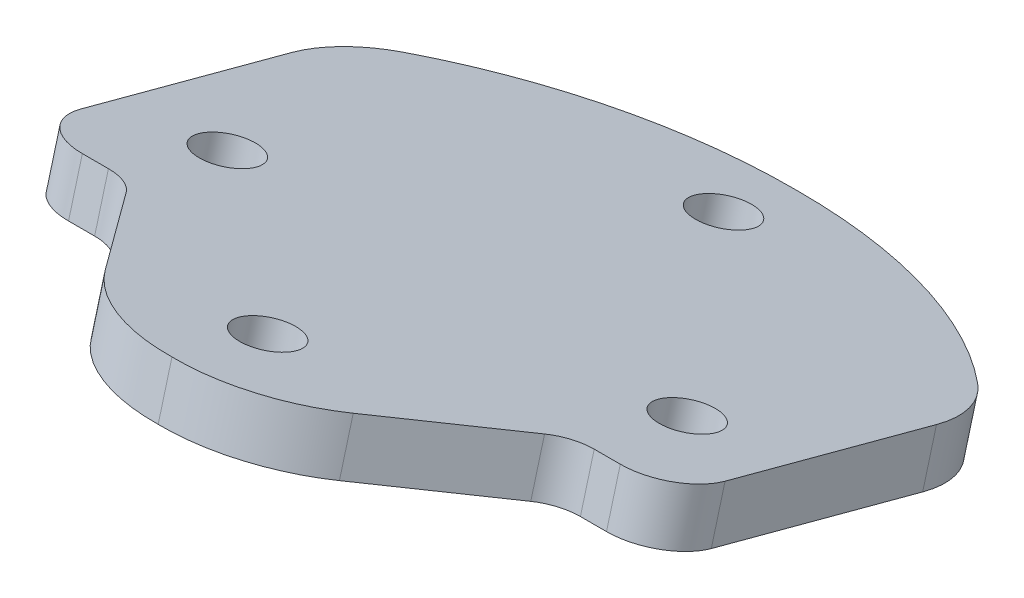
ISO-10303-21;
HEADER;
FILE_DESCRIPTION(('STEP AP214'),'2;1');
FILE_NAME('part.step','',(''),(''),'','','');
FILE_SCHEMA(('AUTOMOTIVE_DESIGN { 1 0 10303 214 1 1 1 1 }'));
ENDSEC;
DATA;
#1=APPLICATION_CONTEXT('core data for automotive mechanical design processes');
#2=APPLICATION_PROTOCOL_DEFINITION('international standard','automotive_design',2000,#1);
#3=PRODUCT_CONTEXT('',#1,'mechanical');
#4=PRODUCT('Part','Part','',(#3));
#5=PRODUCT_RELATED_PRODUCT_CATEGORY('part','',(#4));
#6=PRODUCT_DEFINITION_FORMATION('','',#4);
#7=PRODUCT_DEFINITION_CONTEXT('part definition',#1,'design');
#8=PRODUCT_DEFINITION('design','',#6,#7);
#9=PRODUCT_DEFINITION_SHAPE('','',#8);
#10=(LENGTH_UNIT() NAMED_UNIT(*) SI_UNIT(.MILLI.,.METRE.));
#11=(NAMED_UNIT(*) PLANE_ANGLE_UNIT() SI_UNIT($,.RADIAN.));
#12=(NAMED_UNIT(*) SI_UNIT($,.STERADIAN.) SOLID_ANGLE_UNIT());
#13=UNCERTAINTY_MEASURE_WITH_UNIT(LENGTH_MEASURE(1.E-05),#10,'distance_accuracy_value','');
#14=(GEOMETRIC_REPRESENTATION_CONTEXT(3) GLOBAL_UNCERTAINTY_ASSIGNED_CONTEXT((#13)) GLOBAL_UNIT_ASSIGNED_CONTEXT((#10,
#11,#12)) REPRESENTATION_CONTEXT('',''));
#15=CARTESIAN_POINT('',(0.,0.,0.));
#16=DIRECTION('',(0.,0.,1.));
#17=DIRECTION('',(1.,0.,0.));
#18=AXIS2_PLACEMENT_3D('',#15,#16,#17);
#19=CARTESIAN_POINT('',(-0.117041464112821,16.1604894134968,12.7139875095251));
#20=DIRECTION('',(0.,0.965925826289068,-0.258819045102521));
#21=DIRECTION('',(0.,0.258819045102521,0.965925826289068));
#22=AXIS2_PLACEMENT_3D('',#19,#20,#21);
#23=PLANE('',#22);
#24=CARTESIAN_POINT('',(-26.4813951635032,18.7148385207877,22.2469481582029));
#25=DIRECTION('',(0.,0.965925826289068,-0.258819045102521));
#26=DIRECTION('',(0.,0.258819045102521,0.965925826289068));
#27=AXIS2_PLACEMENT_3D('',#24,#25,#26);
#28=CIRCLE('',#27,1.72719999999999);
#29=CARTESIAN_POINT('',(-26.4813951635032,19.1618707754888,23.9152952453694));
#30=VERTEX_POINT('',#29);
#31=EDGE_CURVE('E344',#30,#30,#28,.T.);
#32=ORIENTED_EDGE('',*,*,#31,.F.);
#33=EDGE_LOOP('',(#32));
#34=FACE_BOUND('',#33,.T.);
#35=CARTESIAN_POINT('',(0.916706491786259,18.7148385207877,22.2469481582029));
#36=DIRECTION('',(0.,0.965925826289068,-0.258819045102521));
#37=DIRECTION('',(0.,0.258819045102521,0.965925826289068));
#38=AXIS2_PLACEMENT_3D('',#35,#36,#37);
#39=CIRCLE('',#38,1.72719999999999);
#40=CARTESIAN_POINT('',(0.916706491786259,19.1618707754888,23.9152952453694));
#41=VERTEX_POINT('',#40);
#42=EDGE_CURVE('E182',#41,#41,#39,.T.);
#43=ORIENTED_EDGE('',*,*,#42,.F.);
#44=EDGE_LOOP('',(#43));
#45=FACE_BOUND('',#44,.T.);
#46=CARTESIAN_POINT('',(-0.117041464112821,16.1604894134968,12.7139875095251));
#47=DIRECTION('',(0.,0.965925826289068,-0.258819045102521));
#48=DIRECTION('',(0.,0.258819045102521,0.965925826289068));
#49=AXIS2_PLACEMENT_3D('',#46,#47,#48);
#50=CIRCLE('',#49,6.35);
#51=CARTESIAN_POINT('',(6.23295853588718,16.1604894134968,12.7139875095251));
#52=VERTEX_POINT('',#51);
#53=CARTESIAN_POINT('',(4.12492763376347,14.9374989527009,8.14972497266275));
#54=VERTEX_POINT('',#53);
#55=EDGE_CURVE('E209',#52,#54,#50,.T.);
#56=ORIENTED_EDGE('',*,*,#55,.T.);
#57=CARTESIAN_POINT('',(-12.786925328463,19.8133088348476,26.3464951808804));
#58=DIRECTION('',(0.,0.965925826289068,-0.258819045102521));
#59=DIRECTION('',(0.,0.258819045102521,0.965925826289068));
#60=AXIS2_PLACEMENT_3D('',#57,#58,#59);
#61=CIRCLE('',#60,25.3161359340932);
#62=CARTESIAN_POINT('',(-12.9657575215172,13.2611741870812,1.89359577738403));
#63=VERTEX_POINT('',#62);
#64=EDGE_CURVE('E117',#54,#63,#61,.T.);
#65=ORIENTED_EDGE('',*,*,#64,.T.);
#66=CARTESIAN_POINT('',(-13.1445897158997,19.8133088348476,26.3464951808804));
#67=DIRECTION('',(0.,0.965925826289068,-0.258819045102521));
#68=DIRECTION('',(0.,0.258819045102521,0.965925826289068));
#69=AXIS2_PLACEMENT_3D('',#66,#67,#68);
#70=CIRCLE('',#69,25.3161359340978);
#71=CARTESIAN_POINT('',(-30.0564426781292,14.9374989527,8.14972497265938));
#72=VERTEX_POINT('',#71);
#73=EDGE_CURVE('E248',#63,#72,#70,.T.);
#74=ORIENTED_EDGE('',*,*,#73,.T.);
#75=CARTESIAN_POINT('',(-25.8144735802498,16.1604894134968,12.7139875095251));
#76=DIRECTION('',(0.,0.965925826289068,-0.258819045102521));
#77=DIRECTION('',(0.,0.258819045102521,0.965925826289068));
#78=AXIS2_PLACEMENT_3D('',#75,#76,#77);
#79=CIRCLE('',#78,6.35);
#80=CARTESIAN_POINT('',(-32.1644735802498,16.1604894134968,12.7139875095251));
#81=VERTEX_POINT('',#80);
#82=EDGE_CURVE('E267',#72,#81,#79,.T.);
#83=ORIENTED_EDGE('',*,*,#82,.T.);
#84=DIRECTION('',(0.,0.258819045102521,0.965925826289068));
#85=VECTOR('',#84,1.);
#86=CARTESIAN_POINT('',(-32.1644735802498,16.1604894134968,12.7139875095251));
#87=LINE('',#86,#85);
#88=CARTESIAN_POINT('',(-32.1644735802498,19.5349749627771,25.3077390288462));
#89=VERTEX_POINT('',#88);
#90=EDGE_CURVE('E264',#81,#89,#87,.T.);
#91=ORIENTED_EDGE('',*,*,#90,.T.);
#92=CARTESIAN_POINT('',(-28.9894735802498,19.5349749627771,25.3077390288462));
#93=DIRECTION('',(0.,0.965925826289068,-0.258819045102521));
#94=DIRECTION('',(0.,0.258819045102521,0.965925826289068));
#95=AXIS2_PLACEMENT_3D('',#92,#93,#94);
#96=CIRCLE('',#95,3.175);
#97=CARTESIAN_POINT('',(-28.9894735802498,20.3567254309776,28.374553527314));
#98=VERTEX_POINT('',#97);
#99=EDGE_CURVE('E266',#89,#98,#96,.T.);
#100=ORIENTED_EDGE('',*,*,#99,.T.);
#101=DIRECTION('',(1.,0.,0.));
#102=VECTOR('',#101,1.);
#103=CARTESIAN_POINT('',(-28.9894735802498,20.3567254309776,28.374553527314));
#104=LINE('',#103,#102);
#105=CARTESIAN_POINT('',(-27.4353305887517,20.3567254309776,28.374553527314));
#106=VERTEX_POINT('',#105);
#107=EDGE_CURVE('E269',#98,#106,#104,.T.);
#108=ORIENTED_EDGE('',*,*,#107,.T.);
#109=CARTESIAN_POINT('',(-27.4353305887517,21.0141258055381,30.8280051260883));
#110=DIRECTION('',(0.,-0.965925826289068,0.258819045102521));
#111=DIRECTION('',(0.,0.258819045102521,0.965925826289068));
#112=AXIS2_PLACEMENT_3D('',#109,#110,#111);
#113=CIRCLE('',#112,2.54);
#114=CARTESIAN_POINT('',(-25.4278114680507,20.6113758453286,29.3249218118402));
#115=VERTEX_POINT('',#114);
#116=EDGE_CURVE('E275',#106,#115,#113,.T.);
#117=ORIENTED_EDGE('',*,*,#116,.T.);
#118=DIRECTION('',(0.612640296225555,0.204560701513737,0.763430931281194));
#119=VECTOR('',#118,1.);
#120=CARTESIAN_POINT('',(-25.4278114680507,20.6113758453286,29.3249218118402));
#121=LINE('',#120,#119);
#122=CARTESIAN_POINT('',(-20.3532766559652,22.3057639020869,35.6484641274003));
#123=VERTEX_POINT('',#122);
#124=EDGE_CURVE('E277',#115,#123,#121,.T.);
#125=ORIENTED_EDGE('',*,*,#124,.T.);
#126=CARTESIAN_POINT('',(-13.1445897158997,20.8595518344977,30.2511272126381));
#127=DIRECTION('',(0.,0.965925826289068,-0.258819045102521));
#128=DIRECTION('',(0.,0.258819045102521,0.965925826289068));
#129=AXIS2_PLACEMENT_3D('',#126,#127,#128);
#130=CIRCLE('',#129,9.12074243226756);
#131=CARTESIAN_POINT('',(-12.9657575226935,23.2197198765257,39.0593942598867));
#132=VERTEX_POINT('',#131);
#133=EDGE_CURVE('E279',#123,#132,#130,.T.);
#134=ORIENTED_EDGE('',*,*,#133,.T.);
#135=CARTESIAN_POINT('',(-12.7869253284629,20.8595518344977,30.2511272126381));
#136=DIRECTION('',(0.,0.965925826289068,-0.258819045102521));
#137=DIRECTION('',(0.,0.258819045102521,0.965925826289068));
#138=AXIS2_PLACEMENT_3D('',#135,#136,#137);
#139=CIRCLE('',#138,9.1207424322776);
#140=CARTESIAN_POINT('',(-5.57823838838954,22.3057639020885,35.6484641274062));
#141=VERTEX_POINT('',#140);
#142=EDGE_CURVE('E281',#132,#141,#139,.T.);
#143=ORIENTED_EDGE('',*,*,#142,.T.);
#144=DIRECTION('',(0.612640296225555,-0.204560701513737,-0.763430931281194));
#145=VECTOR('',#144,1.);
#146=CARTESIAN_POINT('',(-0.503703576311965,20.6113758453286,29.3249218118402));
#147=LINE('',#146,#145);
#148=CARTESIAN_POINT('',(-0.503703576311968,20.6113758453286,29.3249218118402));
#149=VERTEX_POINT('',#148);
#150=EDGE_CURVE('E283',#141,#149,#147,.T.);
#151=ORIENTED_EDGE('',*,*,#150,.T.);
#152=CARTESIAN_POINT('',(1.50381554438904,21.0141258055381,30.8280051260883));
#153=DIRECTION('',(0.,-0.965925826289068,0.258819045102521));
#154=DIRECTION('',(0.,0.258819045102521,0.965925826289068));
#155=AXIS2_PLACEMENT_3D('',#152,#153,#154);
#156=CIRCLE('',#155,2.53999999999999);
#157=CARTESIAN_POINT('',(1.50381554438904,20.3567254309776,28.374553527314));
#158=VERTEX_POINT('',#157);
#159=EDGE_CURVE('E160',#149,#158,#156,.T.);
#160=ORIENTED_EDGE('',*,*,#159,.T.);
#161=DIRECTION('',(1.,0.,0.));
#162=VECTOR('',#161,1.);
#163=CARTESIAN_POINT('',(1.50381554438904,20.3567254309776,28.374553527314));
#164=LINE('',#163,#162);
#165=CARTESIAN_POINT('',(3.05795853588715,20.3567254309776,28.374553527314));
#166=VERTEX_POINT('',#165);
#167=EDGE_CURVE('E154',#158,#166,#164,.T.);
#168=ORIENTED_EDGE('',*,*,#167,.T.);
#169=CARTESIAN_POINT('',(3.05795853588717,19.5349749627771,25.3077390288462));
#170=DIRECTION('',(0.,0.965925826289068,-0.258819045102521));
#171=DIRECTION('',(0.,0.258819045102521,0.965925826289068));
#172=AXIS2_PLACEMENT_3D('',#169,#170,#171);
#173=CIRCLE('',#172,3.175);
#174=CARTESIAN_POINT('',(6.23295853588718,19.5349749627771,25.3077390288462));
#175=VERTEX_POINT('',#174);
#176=EDGE_CURVE('E158',#166,#175,#173,.T.);
#177=ORIENTED_EDGE('',*,*,#176,.T.);
#178=DIRECTION('',(0.,-0.258819045102521,-0.965925826289068));
#179=VECTOR('',#178,1.);
#180=CARTESIAN_POINT('',(6.23295853588718,16.1604894134968,12.7139875095251));
#181=LINE('',#180,#179);
#182=EDGE_CURVE('E50',#175,#52,#181,.T.);
#183=ORIENTED_EDGE('',*,*,#182,.T.);
#184=EDGE_LOOP('',(#56,#65,#74,#83,#91,#100,#108,#117,#125,#134,#143,#151,#160,#168,#177,#183));
#185=FACE_BOUND('',#184,.T.);
#186=CARTESIAN_POINT('',(-12.7823443358585,21.7412202965782,33.5415587085534));
#187=DIRECTION('',(0.,0.965925826289068,-0.258819045102521));
#188=DIRECTION('',(0.,0.258819045102521,0.965925826289068));
#189=AXIS2_PLACEMENT_3D('',#186,#187,#188);
#190=CIRCLE('',#189,1.72719999999999);
#191=CARTESIAN_POINT('',(-12.7823443358585,22.1882525512792,35.2099057957198));
#192=VERTEX_POINT('',#191);
#193=EDGE_CURVE('E350',#192,#192,#190,.T.);
#194=ORIENTED_EDGE('',*,*,#193,.F.);
#195=EDGE_LOOP('',(#194));
#196=FACE_BOUND('',#195,.T.);
#197=CARTESIAN_POINT('',(-12.7823443358585,14.4646938252604,6.38519221497564));
#198=DIRECTION('',(0.,0.965925826289068,-0.258819045102521));
#199=DIRECTION('',(0.,0.258819045102521,0.965925826289068));
#200=AXIS2_PLACEMENT_3D('',#197,#198,#199);
#201=CIRCLE('',#200,1.7272);
#202=CARTESIAN_POINT('',(-12.7823443358585,14.9117260799615,8.05353930214211));
#203=VERTEX_POINT('',#202);
#204=EDGE_CURVE('E335',#203,#203,#201,.T.);
#205=ORIENTED_EDGE('',*,*,#204,.F.);
#206=EDGE_LOOP('',(#205));
#207=FACE_BOUND('',#206,.T.);
#208=ADVANCED_FACE('F33',(#34,#45,#185,#196,#207),#23,.T.);
#209=CARTESIAN_POINT('',(-0.117041464112821,13.093674915029,13.5357379777256));
#210=DIRECTION('',(0.,0.965925826289068,-0.258819045102521));
#211=DIRECTION('',(0.,0.258819045102521,0.965925826289068));
#212=AXIS2_PLACEMENT_3D('',#209,#210,#211);
#213=PLANE('',#212);
#214=CARTESIAN_POINT('',(-26.4813951635032,15.6480240223199,23.0686986264034));
#215=DIRECTION('',(0.,0.965925826289068,-0.258819045102521));
#216=DIRECTION('',(0.,0.258819045102521,0.965925826289068));
#217=AXIS2_PLACEMENT_3D('',#214,#215,#216);
#218=CIRCLE('',#217,1.72719999999999);
#219=CARTESIAN_POINT('',(-26.4813951635032,16.095056277021,24.7370457135699));
#220=VERTEX_POINT('',#219);
#221=EDGE_CURVE('E341',#220,#220,#218,.T.);
#222=ORIENTED_EDGE('',*,*,#221,.T.);
#223=EDGE_LOOP('',(#222));
#224=FACE_BOUND('',#223,.T.);
#225=CARTESIAN_POINT('',(0.916706491786259,15.6480240223199,23.0686986264034));
#226=DIRECTION('',(0.,0.965925826289068,-0.258819045102521));
#227=DIRECTION('',(0.,0.258819045102521,0.965925826289068));
#228=AXIS2_PLACEMENT_3D('',#225,#226,#227);
#229=CIRCLE('',#228,1.72719999999999);
#230=CARTESIAN_POINT('',(0.916706491786259,16.095056277021,24.7370457135699));
#231=VERTEX_POINT('',#230);
#232=EDGE_CURVE('E353',#231,#231,#229,.T.);
#233=ORIENTED_EDGE('',*,*,#232,.T.);
#234=EDGE_LOOP('',(#233));
#235=FACE_BOUND('',#234,.T.);
#236=CARTESIAN_POINT('',(-0.117041464112821,13.093674915029,13.5357379777256));
#237=DIRECTION('',(0.,0.965925826289068,-0.258819045102521));
#238=DIRECTION('',(0.,0.258819045102521,0.965925826289068));
#239=AXIS2_PLACEMENT_3D('',#236,#237,#238);
#240=CIRCLE('',#239,6.35);
#241=CARTESIAN_POINT('',(6.23295853588718,13.093674915029,13.5357379777256));
#242=VERTEX_POINT('',#241);
#243=CARTESIAN_POINT('',(4.12492763376347,11.8706844542331,8.97147544086325));
#244=VERTEX_POINT('',#243);
#245=EDGE_CURVE('E178',#242,#244,#240,.T.);
#246=ORIENTED_EDGE('',*,*,#245,.F.);
#247=DIRECTION('',(0.,-0.258819045102521,-0.965925826289068));
#248=VECTOR('',#247,1.);
#249=CARTESIAN_POINT('',(6.23295853588718,13.093674915029,13.5357379777256));
#250=LINE('',#249,#248);
#251=CARTESIAN_POINT('',(6.23295853588718,16.4681604643093,26.1294894970467));
#252=VERTEX_POINT('',#251);
#253=EDGE_CURVE('E109',#252,#242,#250,.T.);
#254=ORIENTED_EDGE('',*,*,#253,.F.);
#255=CARTESIAN_POINT('',(3.05795853588717,16.4681604643093,26.1294894970468));
#256=DIRECTION('',(0.,0.965925826289068,-0.258819045102521));
#257=DIRECTION('',(0.,0.258819045102521,0.965925826289068));
#258=AXIS2_PLACEMENT_3D('',#255,#256,#257);
#259=CIRCLE('',#258,3.175);
#260=CARTESIAN_POINT('',(3.05795853588715,17.2899109325099,29.1963039955145));
#261=VERTEX_POINT('',#260);
#262=EDGE_CURVE('E103',#261,#252,#259,.T.);
#263=ORIENTED_EDGE('',*,*,#262,.F.);
#264=DIRECTION('',(1.,0.,0.));
#265=VECTOR('',#264,1.);
#266=CARTESIAN_POINT('',(1.50381554438904,17.2899109325099,29.1963039955145));
#267=LINE('',#266,#265);
#268=CARTESIAN_POINT('',(1.50381554438904,17.2899109325099,29.1963039955145));
#269=VERTEX_POINT('',#268);
#270=EDGE_CURVE('E168',#269,#261,#267,.T.);
#271=ORIENTED_EDGE('',*,*,#270,.F.);
#272=CARTESIAN_POINT('',(1.50381554438904,17.9473113070703,31.6497555942888));
#273=DIRECTION('',(0.,-0.965925826289068,0.258819045102521));
#274=DIRECTION('',(0.,0.258819045102521,0.965925826289068));
#275=AXIS2_PLACEMENT_3D('',#272,#273,#274);
#276=CIRCLE('',#275,2.53999999999999);
#277=CARTESIAN_POINT('',(-0.503703576311968,17.5445613468608,30.1466722800407));
#278=VERTEX_POINT('',#277);
#279=EDGE_CURVE('E204',#278,#269,#276,.T.);
#280=ORIENTED_EDGE('',*,*,#279,.F.);
#281=DIRECTION('',(0.612640296225555,-0.204560701513737,-0.763430931281194));
#282=VECTOR('',#281,1.);
#283=CARTESIAN_POINT('',(-0.503703576311965,17.5445613468608,30.1466722800407));
#284=LINE('',#283,#282);
#285=CARTESIAN_POINT('',(-5.57823838838954,19.2389494036207,36.4702145956067));
#286=VERTEX_POINT('',#285);
#287=EDGE_CURVE('E202',#286,#278,#284,.T.);
#288=ORIENTED_EDGE('',*,*,#287,.F.);
#289=CARTESIAN_POINT('',(-12.7869253284629,17.7927373360299,31.0728776808386));
#290=DIRECTION('',(0.,0.965925826289068,-0.258819045102521));
#291=DIRECTION('',(0.,0.258819045102521,0.965925826289068));
#292=AXIS2_PLACEMENT_3D('',#289,#290,#291);
#293=CIRCLE('',#292,9.1207424322776);
#294=CARTESIAN_POINT('',(-12.9657575226935,20.1529053780579,39.8811447280872));
#295=VERTEX_POINT('',#294);
#296=EDGE_CURVE('E200',#295,#286,#293,.T.);
#297=ORIENTED_EDGE('',*,*,#296,.F.);
#298=CARTESIAN_POINT('',(-13.1445897158997,17.7927373360299,31.0728776808386));
#299=DIRECTION('',(0.,0.965925826289068,-0.258819045102521));
#300=DIRECTION('',(0.,0.258819045102521,0.965925826289068));
#301=AXIS2_PLACEMENT_3D('',#298,#299,#300);
#302=CIRCLE('',#301,9.12074243226756);
#303=CARTESIAN_POINT('',(-20.3532766559652,19.2389494036191,36.4702145956008));
#304=VERTEX_POINT('',#303);
#305=EDGE_CURVE('E198',#304,#295,#302,.T.);
#306=ORIENTED_EDGE('',*,*,#305,.F.);
#307=DIRECTION('',(0.612640296225555,0.204560701513737,0.763430931281194));
#308=VECTOR('',#307,1.);
#309=CARTESIAN_POINT('',(-25.4278114680507,17.5445613468608,30.1466722800407));
#310=LINE('',#309,#308);
#311=CARTESIAN_POINT('',(-25.4278114680507,17.5445613468608,30.1466722800407));
#312=VERTEX_POINT('',#311);
#313=EDGE_CURVE('E196',#312,#304,#310,.T.);
#314=ORIENTED_EDGE('',*,*,#313,.F.);
#315=CARTESIAN_POINT('',(-27.4353305887517,17.9473113070703,31.6497555942888));
#316=DIRECTION('',(0.,-0.965925826289068,0.258819045102521));
#317=DIRECTION('',(0.,0.258819045102521,0.965925826289068));
#318=AXIS2_PLACEMENT_3D('',#315,#316,#317);
#319=CIRCLE('',#318,2.54);
#320=CARTESIAN_POINT('',(-27.4353305887517,17.2899109325099,29.1963039955145));
#321=VERTEX_POINT('',#320);
#322=EDGE_CURVE('E194',#321,#312,#319,.T.);
#323=ORIENTED_EDGE('',*,*,#322,.F.);
#324=DIRECTION('',(1.,0.,0.));
#325=VECTOR('',#324,1.);
#326=CARTESIAN_POINT('',(-28.9894735802498,17.2899109325099,29.1963039955145));
#327=LINE('',#326,#325);
#328=CARTESIAN_POINT('',(-28.9894735802498,17.2899109325099,29.1963039955145));
#329=VERTEX_POINT('',#328);
#330=EDGE_CURVE('E192',#329,#321,#327,.T.);
#331=ORIENTED_EDGE('',*,*,#330,.F.);
#332=CARTESIAN_POINT('',(-28.9894735802498,16.4681604643093,26.1294894970468));
#333=DIRECTION('',(0.,0.965925826289068,-0.258819045102521));
#334=DIRECTION('',(0.,0.258819045102521,0.965925826289068));
#335=AXIS2_PLACEMENT_3D('',#332,#333,#334);
#336=CIRCLE('',#335,3.175);
#337=CARTESIAN_POINT('',(-32.1644735802498,16.4681604643093,26.1294894970467));
#338=VERTEX_POINT('',#337);
#339=EDGE_CURVE('E190',#338,#329,#336,.T.);
#340=ORIENTED_EDGE('',*,*,#339,.F.);
#341=DIRECTION('',(0.,0.258819045102521,0.965925826289068));
#342=VECTOR('',#341,1.);
#343=CARTESIAN_POINT('',(-32.1644735802498,13.093674915029,13.5357379777256));
#344=LINE('',#343,#342);
#345=CARTESIAN_POINT('',(-32.1644735802498,13.093674915029,13.5357379777256));
#346=VERTEX_POINT('',#345);
#347=EDGE_CURVE('E188',#346,#338,#344,.T.);
#348=ORIENTED_EDGE('',*,*,#347,.F.);
#349=CARTESIAN_POINT('',(-25.8144735802498,13.093674915029,13.5357379777256));
#350=DIRECTION('',(0.,0.965925826289068,-0.258819045102521));
#351=DIRECTION('',(0.,0.258819045102521,0.965925826289068));
#352=AXIS2_PLACEMENT_3D('',#349,#350,#351);
#353=CIRCLE('',#352,6.35);
#354=CARTESIAN_POINT('',(-30.0564426781292,11.8706844542322,8.97147544085988));
#355=VERTEX_POINT('',#354);
#356=EDGE_CURVE('E186',#355,#346,#353,.T.);
#357=ORIENTED_EDGE('',*,*,#356,.F.);
#358=CARTESIAN_POINT('',(-13.1445897158997,16.7464943363798,27.1682456490809));
#359=DIRECTION('',(0.,0.965925826289068,-0.258819045102521));
#360=DIRECTION('',(0.,0.258819045102521,0.965925826289068));
#361=AXIS2_PLACEMENT_3D('',#358,#359,#360);
#362=CIRCLE('',#361,25.3161359340978);
#363=CARTESIAN_POINT('',(-12.9657575215172,10.1943596886134,2.71534624558453));
#364=VERTEX_POINT('',#363);
#365=EDGE_CURVE('E184',#364,#355,#362,.T.);
#366=ORIENTED_EDGE('',*,*,#365,.F.);
#367=CARTESIAN_POINT('',(-12.786925328463,16.7464943363798,27.1682456490809));
#368=DIRECTION('',(0.,0.965925826289068,-0.258819045102521));
#369=DIRECTION('',(0.,0.258819045102521,0.965925826289068));
#370=AXIS2_PLACEMENT_3D('',#367,#368,#369);
#371=CIRCLE('',#370,25.3161359340932);
#372=EDGE_CURVE('E181',#244,#364,#371,.T.);
#373=ORIENTED_EDGE('',*,*,#372,.F.);
#374=EDGE_LOOP('',(#246,#254,#263,#271,#280,#288,#297,#306,#314,#323,#331,#340,#348,#357,#366,#373));
#375=FACE_BOUND('',#374,.T.);
#376=CARTESIAN_POINT('',(-12.7823443358585,18.6744057981104,34.3633091767539));
#377=DIRECTION('',(0.,0.965925826289068,-0.258819045102521));
#378=DIRECTION('',(0.,0.258819045102521,0.965925826289068));
#379=AXIS2_PLACEMENT_3D('',#376,#377,#378);
#380=CIRCLE('',#379,1.72719999999999);
#381=CARTESIAN_POINT('',(-12.7823443358585,19.1214380528114,36.0316562639203));
#382=VERTEX_POINT('',#381);
#383=EDGE_CURVE('E347',#382,#382,#380,.T.);
#384=ORIENTED_EDGE('',*,*,#383,.T.);
#385=EDGE_LOOP('',(#384));
#386=FACE_BOUND('',#385,.T.);
#387=CARTESIAN_POINT('',(-12.7823443358585,11.3978793267926,7.20694268317614));
#388=DIRECTION('',(0.,0.965925826289068,-0.258819045102521));
#389=DIRECTION('',(0.,0.258819045102521,0.965925826289068));
#390=AXIS2_PLACEMENT_3D('',#387,#388,#389);
#391=CIRCLE('',#390,1.7272);
#392=CARTESIAN_POINT('',(-12.7823443358585,11.8449115814937,8.87528977034262));
#393=VERTEX_POINT('',#392);
#394=EDGE_CURVE('E338',#393,#393,#391,.T.);
#395=ORIENTED_EDGE('',*,*,#394,.T.);
#396=EDGE_LOOP('',(#395));
#397=FACE_BOUND('',#396,.T.);
#398=ADVANCED_FACE('F252',(#224,#235,#375,#386,#397),#213,.F.);
#399=CARTESIAN_POINT('',(-0.117041464112821,16.1604894134968,12.7139875095251));
#400=DIRECTION('',(0.,-0.965925826289068,0.258819045102521));
#401=DIRECTION('',(0.,-0.258819045102521,-0.965925826289068));
#402=AXIS2_PLACEMENT_3D('',#399,#400,#401);
#403=CYLINDRICAL_SURFACE('',#402,6.35);
#404=ORIENTED_EDGE('',*,*,#245,.T.);
#405=DIRECTION('',(0.,-0.965925826289068,0.258819045102521));
#406=VECTOR('',#405,1.);
#407=CARTESIAN_POINT('',(4.12492763376347,14.9374989527009,8.14972497266275));
#408=LINE('',#407,#406);
#409=EDGE_CURVE('E11',#54,#244,#408,.T.);
#410=ORIENTED_EDGE('',*,*,#409,.F.);
#411=ORIENTED_EDGE('',*,*,#55,.F.);
#412=DIRECTION('',(0.,-0.965925826289068,0.258819045102521));
#413=VECTOR('',#412,1.);
#414=CARTESIAN_POINT('',(6.23295853588718,16.1604894134968,12.7139875095251));
#415=LINE('',#414,#413);
#416=EDGE_CURVE('E174',#52,#242,#415,.T.);
#417=ORIENTED_EDGE('',*,*,#416,.T.);
#418=EDGE_LOOP('',(#404,#410,#411,#417));
#419=FACE_BOUND('',#418,.T.);
#420=ADVANCED_FACE('F35',(#419),#403,.T.);
#421=CARTESIAN_POINT('',(-12.786925328463,19.8133088348476,26.3464951808804));
#422=DIRECTION('',(0.,-0.965925826289068,0.258819045102521));
#423=DIRECTION('',(0.,-0.258819045102521,-0.965925826289068));
#424=AXIS2_PLACEMENT_3D('',#421,#422,#423);
#425=CYLINDRICAL_SURFACE('',#424,25.3161359340932);
#426=ORIENTED_EDGE('',*,*,#372,.T.);
#427=DIRECTION('',(0.,-0.965925826289068,0.258819045102521));
#428=VECTOR('',#427,1.);
#429=CARTESIAN_POINT('',(-12.9657575215172,13.2611741870812,1.89359577738403));
#430=LINE('',#429,#428);
#431=EDGE_CURVE('E42',#63,#364,#430,.T.);
#432=ORIENTED_EDGE('',*,*,#431,.F.);
#433=ORIENTED_EDGE('',*,*,#64,.F.);
#434=ORIENTED_EDGE('',*,*,#409,.T.);
#435=EDGE_LOOP('',(#426,#432,#433,#434));
#436=FACE_BOUND('',#435,.T.);
#437=ADVANCED_FACE('F502',(#436),#425,.T.);
#438=CARTESIAN_POINT('',(-13.1445897158997,19.8133088348476,26.3464951808804));
#439=DIRECTION('',(0.,-0.965925826289068,0.258819045102521));
#440=DIRECTION('',(0.,-0.258819045102521,-0.965925826289068));
#441=AXIS2_PLACEMENT_3D('',#438,#439,#440);
#442=CYLINDRICAL_SURFACE('',#441,25.3161359340978);
#443=ORIENTED_EDGE('',*,*,#365,.T.);
#444=DIRECTION('',(0.,-0.965925826289068,0.258819045102521));
#445=VECTOR('',#444,1.);
#446=CARTESIAN_POINT('',(-30.0564426781292,14.9374989527,8.14972497265938));
#447=LINE('',#446,#445);
#448=EDGE_CURVE('E240',#72,#355,#447,.T.);
#449=ORIENTED_EDGE('',*,*,#448,.F.);
#450=ORIENTED_EDGE('',*,*,#73,.F.);
#451=ORIENTED_EDGE('',*,*,#431,.T.);
#452=EDGE_LOOP('',(#443,#449,#450,#451));
#453=FACE_BOUND('',#452,.T.);
#454=ADVANCED_FACE('F246',(#453),#442,.T.);
#455=CARTESIAN_POINT('',(-25.8144735802498,16.1604894134968,12.7139875095251));
#456=DIRECTION('',(0.,-0.965925826289068,0.258819045102521));
#457=DIRECTION('',(0.,-0.258819045102521,-0.965925826289068));
#458=AXIS2_PLACEMENT_3D('',#455,#456,#457);
#459=CYLINDRICAL_SURFACE('',#458,6.35);
#460=ORIENTED_EDGE('',*,*,#356,.T.);
#461=DIRECTION('',(0.,-0.965925826289068,0.258819045102521));
#462=VECTOR('',#461,1.);
#463=CARTESIAN_POINT('',(-32.1644735802498,16.1604894134968,12.7139875095251));
#464=LINE('',#463,#462);
#465=EDGE_CURVE('E237',#81,#346,#464,.T.);
#466=ORIENTED_EDGE('',*,*,#465,.F.);
#467=ORIENTED_EDGE('',*,*,#82,.F.);
#468=ORIENTED_EDGE('',*,*,#448,.T.);
#469=EDGE_LOOP('',(#460,#466,#467,#468));
#470=FACE_BOUND('',#469,.T.);
#471=ADVANCED_FACE('F258',(#470),#459,.T.);
#472=CARTESIAN_POINT('',(-32.1644735802498,16.1604894134968,12.7139875095251));
#473=DIRECTION('',(1.,0.,0.));
#474=DIRECTION('',(0.,0.,-1.));
#475=AXIS2_PLACEMENT_3D('',#472,#473,#474);
#476=PLANE('',#475);
#477=ORIENTED_EDGE('',*,*,#347,.T.);
#478=DIRECTION('',(0.,-0.965925826289068,0.258819045102521));
#479=VECTOR('',#478,1.);
#480=CARTESIAN_POINT('',(-32.1644735802498,19.5349749627771,25.3077390288462));
#481=LINE('',#480,#479);
#482=EDGE_CURVE('E234',#89,#338,#481,.T.);
#483=ORIENTED_EDGE('',*,*,#482,.F.);
#484=ORIENTED_EDGE('',*,*,#90,.F.);
#485=ORIENTED_EDGE('',*,*,#465,.T.);
#486=EDGE_LOOP('',(#477,#483,#484,#485));
#487=FACE_BOUND('',#486,.T.);
#488=ADVANCED_FACE('F262',(#487),#476,.F.);
#489=CARTESIAN_POINT('',(-28.9894735802498,19.5349749627771,25.3077390288462));
#490=DIRECTION('',(0.,-0.965925826289068,0.258819045102521));
#491=DIRECTION('',(0.,-0.258819045102521,-0.965925826289068));
#492=AXIS2_PLACEMENT_3D('',#489,#490,#491);
#493=CYLINDRICAL_SURFACE('',#492,3.175);
#494=ORIENTED_EDGE('',*,*,#339,.T.);
#495=DIRECTION('',(0.,-0.965925826289068,0.258819045102521));
#496=VECTOR('',#495,1.);
#497=CARTESIAN_POINT('',(-28.9894735802498,20.3567254309776,28.374553527314));
#498=LINE('',#497,#496);
#499=EDGE_CURVE('E231',#98,#329,#498,.T.);
#500=ORIENTED_EDGE('',*,*,#499,.F.);
#501=ORIENTED_EDGE('',*,*,#99,.F.);
#502=ORIENTED_EDGE('',*,*,#482,.T.);
#503=EDGE_LOOP('',(#494,#500,#501,#502));
#504=FACE_BOUND('',#503,.T.);
#505=ADVANCED_FACE('F467',(#504),#493,.T.);
#506=CARTESIAN_POINT('',(-28.9894735802498,20.3567254309776,28.374553527314));
#507=DIRECTION('',(0.,-0.258819045102521,-0.965925826289068));
#508=DIRECTION('',(0.,0.965925826289068,-0.258819045102521));
#509=AXIS2_PLACEMENT_3D('',#506,#507,#508);
#510=PLANE('',#509);
#511=ORIENTED_EDGE('',*,*,#330,.T.);
#512=DIRECTION('',(0.,-0.965925826289068,0.258819045102521));
#513=VECTOR('',#512,1.);
#514=CARTESIAN_POINT('',(-27.4353305887517,20.3567254309776,28.374553527314));
#515=LINE('',#514,#513);
#516=EDGE_CURVE('E228',#106,#321,#515,.T.);
#517=ORIENTED_EDGE('',*,*,#516,.F.);
#518=ORIENTED_EDGE('',*,*,#107,.F.);
#519=ORIENTED_EDGE('',*,*,#499,.T.);
#520=EDGE_LOOP('',(#511,#517,#518,#519));
#521=FACE_BOUND('',#520,.T.);
#522=ADVANCED_FACE('F457',(#521),#510,.F.);
#523=CARTESIAN_POINT('',(-27.4353305887517,21.0141258055381,30.8280051260883));
#524=DIRECTION('',(0.,-0.965925826289068,0.258819045102521));
#525=DIRECTION('',(0.,-0.258819045102521,-0.965925826289068));
#526=AXIS2_PLACEMENT_3D('',#523,#524,#525);
#527=CYLINDRICAL_SURFACE('',#526,2.54);
#528=ORIENTED_EDGE('',*,*,#322,.T.);
#529=DIRECTION('',(0.,-0.965925826289068,0.258819045102521));
#530=VECTOR('',#529,1.);
#531=CARTESIAN_POINT('',(-25.4278114680507,20.6113758453286,29.3249218118402));
#532=LINE('',#531,#530);
#533=EDGE_CURVE('E225',#115,#312,#532,.T.);
#534=ORIENTED_EDGE('',*,*,#533,.F.);
#535=ORIENTED_EDGE('',*,*,#116,.F.);
#536=ORIENTED_EDGE('',*,*,#516,.T.);
#537=EDGE_LOOP('',(#528,#534,#535,#536));
#538=FACE_BOUND('',#537,.T.);
#539=ADVANCED_FACE('F447',(#538),#527,.F.);
#540=CARTESIAN_POINT('',(-25.4278114680507,20.6113758453286,29.3249218118402));
#541=DIRECTION('',(0.790361858543708,-0.158562976460424,-0.591765084349649));
#542=DIRECTION('',(-0.59934751022516,0.,-0.800488951820637));
#543=AXIS2_PLACEMENT_3D('',#540,#541,#542);
#544=PLANE('',#543);
#545=ORIENTED_EDGE('',*,*,#313,.T.);
#546=DIRECTION('',(0.,-0.965925826289068,0.258819045102521));
#547=VECTOR('',#546,1.);
#548=CARTESIAN_POINT('',(-20.3532766559652,22.3057639020869,35.6484641274003));
#549=LINE('',#548,#547);
#550=EDGE_CURVE('E222',#123,#304,#549,.T.);
#551=ORIENTED_EDGE('',*,*,#550,.F.);
#552=ORIENTED_EDGE('',*,*,#124,.F.);
#553=ORIENTED_EDGE('',*,*,#533,.T.);
#554=EDGE_LOOP('',(#545,#551,#552,#553));
#555=FACE_BOUND('',#554,.T.);
#556=ADVANCED_FACE('F437',(#555),#544,.F.);
#557=CARTESIAN_POINT('',(-13.1445897158997,20.8595518344977,30.2511272126381));
#558=DIRECTION('',(0.,-0.965925826289068,0.258819045102521));
#559=DIRECTION('',(0.,-0.258819045102521,-0.965925826289068));
#560=AXIS2_PLACEMENT_3D('',#557,#558,#559);
#561=CYLINDRICAL_SURFACE('',#560,9.12074243226756);
#562=ORIENTED_EDGE('',*,*,#305,.T.);
#563=DIRECTION('',(0.,-0.965925826289068,0.258819045102521));
#564=VECTOR('',#563,1.);
#565=CARTESIAN_POINT('',(-12.9657575226935,23.2197198765257,39.0593942598867));
#566=LINE('',#565,#564);
#567=EDGE_CURVE('E219',#132,#295,#566,.T.);
#568=ORIENTED_EDGE('',*,*,#567,.F.);
#569=ORIENTED_EDGE('',*,*,#133,.F.);
#570=ORIENTED_EDGE('',*,*,#550,.T.);
#571=EDGE_LOOP('',(#562,#568,#569,#570));
#572=FACE_BOUND('',#571,.T.);
#573=ADVANCED_FACE('F427',(#572),#561,.T.);
#574=CARTESIAN_POINT('',(-12.7869253284629,20.8595518344977,30.2511272126381));
#575=DIRECTION('',(0.,-0.965925826289068,0.258819045102521));
#576=DIRECTION('',(0.,-0.258819045102521,-0.965925826289068));
#577=AXIS2_PLACEMENT_3D('',#574,#575,#576);
#578=CYLINDRICAL_SURFACE('',#577,9.1207424322776);
#579=ORIENTED_EDGE('',*,*,#296,.T.);
#580=DIRECTION('',(0.,-0.965925826289068,0.258819045102521));
#581=VECTOR('',#580,1.);
#582=CARTESIAN_POINT('',(-5.57823838838954,22.3057639020885,35.6484641274062));
#583=LINE('',#582,#581);
#584=EDGE_CURVE('E216',#141,#286,#583,.T.);
#585=ORIENTED_EDGE('',*,*,#584,.F.);
#586=ORIENTED_EDGE('',*,*,#142,.F.);
#587=ORIENTED_EDGE('',*,*,#567,.T.);
#588=EDGE_LOOP('',(#579,#585,#586,#587));
#589=FACE_BOUND('',#588,.T.);
#590=ADVANCED_FACE('F418',(#589),#578,.T.);
#591=CARTESIAN_POINT('',(-0.503703576311965,20.6113758453286,29.3249218118402));
#592=DIRECTION('',(-0.790361858543708,-0.158562976460424,-0.591765084349649));
#593=DIRECTION('',(-0.59934751022516,0.,0.800488951820637));
#594=AXIS2_PLACEMENT_3D('',#591,#592,#593);
#595=PLANE('',#594);
#596=ORIENTED_EDGE('',*,*,#287,.T.);
#597=DIRECTION('',(0.,-0.965925826289068,0.258819045102521));
#598=VECTOR('',#597,1.);
#599=CARTESIAN_POINT('',(-0.503703576311968,20.6113758453286,29.3249218118402));
#600=LINE('',#599,#598);
#601=EDGE_CURVE('E213',#149,#278,#600,.T.);
#602=ORIENTED_EDGE('',*,*,#601,.F.);
#603=ORIENTED_EDGE('',*,*,#150,.F.);
#604=ORIENTED_EDGE('',*,*,#584,.T.);
#605=EDGE_LOOP('',(#596,#602,#603,#604));
#606=FACE_BOUND('',#605,.T.);
#607=ADVANCED_FACE('F289',(#606),#595,.F.);
#608=CARTESIAN_POINT('',(1.50381554438904,21.0141258055381,30.8280051260883));
#609=DIRECTION('',(0.,-0.965925826289068,0.258819045102521));
#610=DIRECTION('',(0.,-0.258819045102521,-0.965925826289068));
#611=AXIS2_PLACEMENT_3D('',#608,#609,#610);
#612=CYLINDRICAL_SURFACE('',#611,2.53999999999999);
#613=ORIENTED_EDGE('',*,*,#279,.T.);
#614=DIRECTION('',(0.,-0.965925826289068,0.258819045102521));
#615=VECTOR('',#614,1.);
#616=CARTESIAN_POINT('',(1.50381554438904,20.3567254309776,28.374553527314));
#617=LINE('',#616,#615);
#618=EDGE_CURVE('E169',#158,#269,#617,.T.);
#619=ORIENTED_EDGE('',*,*,#618,.F.);
#620=ORIENTED_EDGE('',*,*,#159,.F.);
#621=ORIENTED_EDGE('',*,*,#601,.T.);
#622=EDGE_LOOP('',(#613,#619,#620,#621));
#623=FACE_BOUND('',#622,.T.);
#624=ADVANCED_FACE('F293',(#623),#612,.F.);
#625=CARTESIAN_POINT('',(1.50381554438904,20.3567254309776,28.374553527314));
#626=DIRECTION('',(0.,-0.258819045102521,-0.965925826289068));
#627=DIRECTION('',(0.,0.965925826289068,-0.258819045102521));
#628=AXIS2_PLACEMENT_3D('',#625,#626,#627);
#629=PLANE('',#628);
#630=ORIENTED_EDGE('',*,*,#270,.T.);
#631=DIRECTION('',(0.,-0.965925826289068,0.258819045102521));
#632=VECTOR('',#631,1.);
#633=CARTESIAN_POINT('',(3.05795853588715,20.3567254309776,28.374553527314));
#634=LINE('',#633,#632);
#635=EDGE_CURVE('E165',#166,#261,#634,.T.);
#636=ORIENTED_EDGE('',*,*,#635,.F.);
#637=ORIENTED_EDGE('',*,*,#167,.F.);
#638=ORIENTED_EDGE('',*,*,#618,.T.);
#639=EDGE_LOOP('',(#630,#636,#637,#638));
#640=FACE_BOUND('',#639,.T.);
#641=ADVANCED_FACE('F166',(#640),#629,.F.);
#642=CARTESIAN_POINT('',(3.05795853588717,19.5349749627771,25.3077390288462));
#643=DIRECTION('',(0.,-0.965925826289068,0.258819045102521));
#644=DIRECTION('',(0.,-0.258819045102521,-0.965925826289068));
#645=AXIS2_PLACEMENT_3D('',#642,#643,#644);
#646=CYLINDRICAL_SURFACE('',#645,3.175);
#647=ORIENTED_EDGE('',*,*,#262,.T.);
#648=DIRECTION('',(0.,-0.965925826289068,0.258819045102521));
#649=VECTOR('',#648,1.);
#650=CARTESIAN_POINT('',(6.23295853588718,19.5349749627771,25.3077390288462));
#651=LINE('',#650,#649);
#652=EDGE_CURVE('E170',#175,#252,#651,.T.);
#653=ORIENTED_EDGE('',*,*,#652,.F.);
#654=ORIENTED_EDGE('',*,*,#176,.F.);
#655=ORIENTED_EDGE('',*,*,#635,.T.);
#656=EDGE_LOOP('',(#647,#653,#654,#655));
#657=FACE_BOUND('',#656,.T.);
#658=ADVANCED_FACE('F172',(#657),#646,.T.);
#659=CARTESIAN_POINT('',(6.23295853588718,16.1604894134968,12.7139875095251));
#660=DIRECTION('',(-1.,0.,0.));
#661=DIRECTION('',(0.,0.,1.));
#662=AXIS2_PLACEMENT_3D('',#659,#660,#661);
#663=PLANE('',#662);
#664=ORIENTED_EDGE('',*,*,#253,.T.);
#665=ORIENTED_EDGE('',*,*,#416,.F.);
#666=ORIENTED_EDGE('',*,*,#182,.F.);
#667=ORIENTED_EDGE('',*,*,#652,.T.);
#668=EDGE_LOOP('',(#664,#665,#666,#667));
#669=FACE_BOUND('',#668,.T.);
#670=ADVANCED_FACE('F297',(#669),#663,.F.);
#671=CARTESIAN_POINT('',(0.916706491786259,18.7148385207877,22.2469481582029));
#672=DIRECTION('',(0.,-0.965925826289068,0.258819045102521));
#673=DIRECTION('',(0.,-0.258819045102521,-0.965925826289068));
#674=AXIS2_PLACEMENT_3D('',#671,#672,#673);
#675=CYLINDRICAL_SURFACE('',#674,1.72719999999999);
#676=ORIENTED_EDGE('',*,*,#42,.T.);
#677=EDGE_LOOP('',(#676));
#678=FACE_BOUND('',#677,.T.);
#679=ORIENTED_EDGE('',*,*,#232,.F.);
#680=EDGE_LOOP('',(#679));
#681=FACE_BOUND('',#680,.T.);
#682=ADVANCED_FACE('F299',(#678,#681),#675,.F.);
#683=CARTESIAN_POINT('',(-12.7823443358585,21.7412202965782,33.5415587085534));
#684=DIRECTION('',(0.,-0.965925826289068,0.258819045102521));
#685=DIRECTION('',(0.,-0.258819045102521,-0.965925826289068));
#686=AXIS2_PLACEMENT_3D('',#683,#684,#685);
#687=CYLINDRICAL_SURFACE('',#686,1.72719999999999);
#688=ORIENTED_EDGE('',*,*,#193,.T.);
#689=EDGE_LOOP('',(#688));
#690=FACE_BOUND('',#689,.T.);
#691=ORIENTED_EDGE('',*,*,#383,.F.);
#692=EDGE_LOOP('',(#691));
#693=FACE_BOUND('',#692,.T.);
#694=ADVANCED_FACE('F305',(#690,#693),#687,.F.);
#695=CARTESIAN_POINT('',(-26.4813951635032,18.7148385207877,22.2469481582029));
#696=DIRECTION('',(0.,-0.965925826289068,0.258819045102521));
#697=DIRECTION('',(0.,-0.258819045102521,-0.965925826289068));
#698=AXIS2_PLACEMENT_3D('',#695,#696,#697);
#699=CYLINDRICAL_SURFACE('',#698,1.72719999999999);
#700=ORIENTED_EDGE('',*,*,#31,.T.);
#701=EDGE_LOOP('',(#700));
#702=FACE_BOUND('',#701,.T.);
#703=ORIENTED_EDGE('',*,*,#221,.F.);
#704=EDGE_LOOP('',(#703));
#705=FACE_BOUND('',#704,.T.);
#706=ADVANCED_FACE('F322',(#702,#705),#699,.F.);
#707=CARTESIAN_POINT('',(-12.7823443358585,14.4646938252604,6.38519221497564));
#708=DIRECTION('',(0.,-0.965925826289068,0.258819045102521));
#709=DIRECTION('',(0.,-0.258819045102521,-0.965925826289068));
#710=AXIS2_PLACEMENT_3D('',#707,#708,#709);
#711=CYLINDRICAL_SURFACE('',#710,1.7272);
#712=ORIENTED_EDGE('',*,*,#204,.T.);
#713=EDGE_LOOP('',(#712));
#714=FACE_BOUND('',#713,.T.);
#715=ORIENTED_EDGE('',*,*,#394,.F.);
#716=EDGE_LOOP('',(#715));
#717=FACE_BOUND('',#716,.T.);
#718=ADVANCED_FACE('F326',(#714,#717),#711,.F.);
#719=CLOSED_SHELL('',(#208,#398,#420,#437,#454,#471,#488,#505,#522,#539,#556,#573,#590,#607,
#624,#641,#658,#670,#682,#694,#706,#718));
#720=MANIFOLD_SOLID_BREP('B2',#719);
#721=ADVANCED_BREP_SHAPE_REPRESENTATION('',(#18,#720),#14);
#722=SHAPE_DEFINITION_REPRESENTATION(#9,#721);
ENDSEC;
END-ISO-10303-21;
